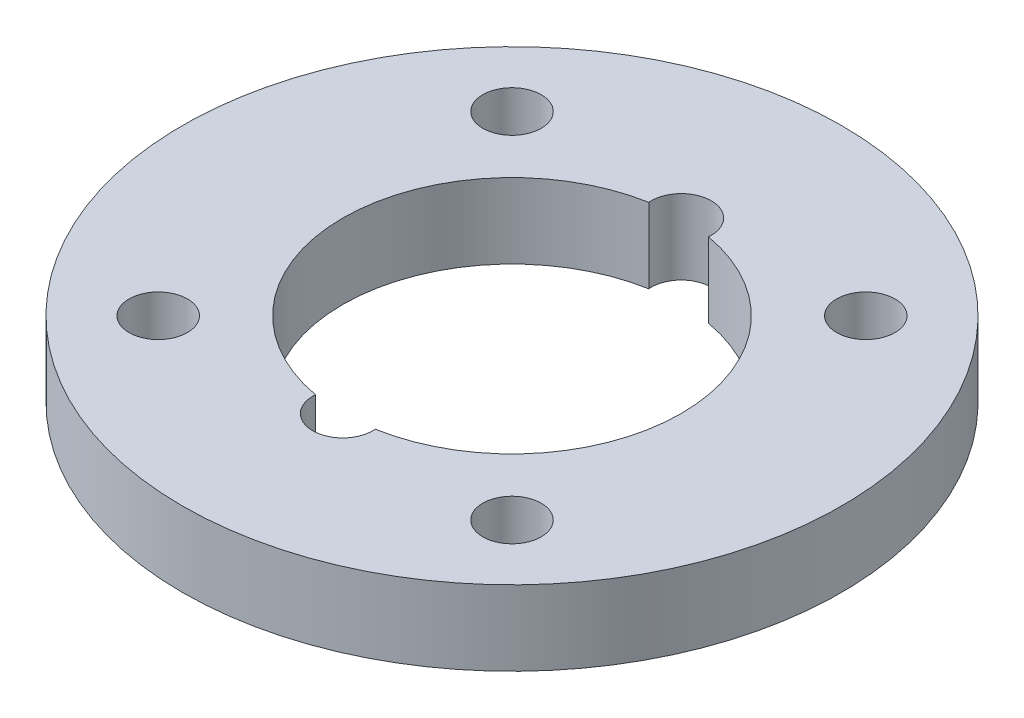
ISO-10303-21;
HEADER;
FILE_DESCRIPTION(('STEP AP214'),'2;1');
FILE_NAME('part.step','',(''),(''),'','','');
FILE_SCHEMA(('AUTOMOTIVE_DESIGN { 1 0 10303 214 1 1 1 1 }'));
ENDSEC;
DATA;
#1=APPLICATION_CONTEXT('core data for automotive mechanical design processes');
#2=APPLICATION_PROTOCOL_DEFINITION('international standard','automotive_design',2000,#1);
#3=PRODUCT_CONTEXT('',#1,'mechanical');
#4=PRODUCT('Part','Part','',(#3));
#5=PRODUCT_RELATED_PRODUCT_CATEGORY('part','',(#4));
#6=PRODUCT_DEFINITION_FORMATION('','',#4);
#7=PRODUCT_DEFINITION_CONTEXT('part definition',#1,'design');
#8=PRODUCT_DEFINITION('design','',#6,#7);
#9=PRODUCT_DEFINITION_SHAPE('','',#8);
#10=(LENGTH_UNIT() NAMED_UNIT(*) SI_UNIT(.MILLI.,.METRE.));
#11=(NAMED_UNIT(*) PLANE_ANGLE_UNIT() SI_UNIT($,.RADIAN.));
#12=(NAMED_UNIT(*) SI_UNIT($,.STERADIAN.) SOLID_ANGLE_UNIT());
#13=UNCERTAINTY_MEASURE_WITH_UNIT(LENGTH_MEASURE(1.E-05),#10,'distance_accuracy_value','');
#14=(GEOMETRIC_REPRESENTATION_CONTEXT(3) GLOBAL_UNCERTAINTY_ASSIGNED_CONTEXT((#13)) GLOBAL_UNIT_ASSIGNED_CONTEXT((#10,
#11,#12)) REPRESENTATION_CONTEXT('',''));
#15=CARTESIAN_POINT('',(0.,0.,0.));
#16=DIRECTION('',(0.,0.,1.));
#17=DIRECTION('',(1.,0.,0.));
#18=AXIS2_PLACEMENT_3D('',#15,#16,#17);
#19=CARTESIAN_POINT('',(0.,6.35,14.351));
#20=DIRECTION('',(0.,-1.,0.));
#21=DIRECTION('',(0.,0.,-1.));
#22=AXIS2_PLACEMENT_3D('',#19,#20,#21);
#23=CYLINDRICAL_SURFACE('',#22,2.53999999999997);
#24=CARTESIAN_POINT('',(0.,0.,14.351));
#25=DIRECTION('',(0.,1.,0.));
#26=DIRECTION('',(0.,0.,1.));
#27=AXIS2_PLACEMENT_3D('',#24,#25,#26);
#28=CIRCLE('',#27,2.53999999999997);
#29=CARTESIAN_POINT('',(2.53003448762568,0.,14.1262212389381));
#30=VERTEX_POINT('',#29);
#31=CARTESIAN_POINT('',(-2.53003448762568,0.,14.1262212389381));
#32=VERTEX_POINT('',#31);
#33=EDGE_CURVE('E125',#30,#32,#28,.F.);
#34=ORIENTED_EDGE('',*,*,#33,.T.);
#35=DIRECTION('',(0.,-1.,0.));
#36=VECTOR('',#35,1.);
#37=CARTESIAN_POINT('',(-2.53003448762568,6.35,14.1262212389381));
#38=LINE('',#37,#36);
#39=CARTESIAN_POINT('',(-2.53003448762568,6.35,14.1262212389381));
#40=VERTEX_POINT('',#39);
#41=EDGE_CURVE('E12',#40,#32,#38,.T.);
#42=ORIENTED_EDGE('',*,*,#41,.F.);
#43=CARTESIAN_POINT('',(0.,6.35,14.351));
#44=DIRECTION('',(0.,1.,0.));
#45=DIRECTION('',(0.,0.,1.));
#46=AXIS2_PLACEMENT_3D('',#43,#44,#45);
#47=CIRCLE('',#46,2.53999999999997);
#48=CARTESIAN_POINT('',(2.53003448762568,6.35,14.1262212389381));
#49=VERTEX_POINT('',#48);
#50=EDGE_CURVE('E100',#49,#40,#47,.F.);
#51=ORIENTED_EDGE('',*,*,#50,.F.);
#52=DIRECTION('',(0.,-1.,0.));
#53=VECTOR('',#52,1.);
#54=CARTESIAN_POINT('',(2.53003448762568,6.35,14.1262212389381));
#55=LINE('',#54,#53);
#56=EDGE_CURVE('E103',#49,#30,#55,.T.);
#57=ORIENTED_EDGE('',*,*,#56,.T.);
#58=EDGE_LOOP('',(#34,#42,#51,#57));
#59=FACE_BOUND('',#58,.T.);
#60=ADVANCED_FACE('F44',(#59),#23,.F.);
#61=CARTESIAN_POINT('',(0.,6.35,0.));
#62=DIRECTION('',(0.,-1.,0.));
#63=DIRECTION('',(0.,0.,-1.));
#64=AXIS2_PLACEMENT_3D('',#61,#62,#63);
#65=CYLINDRICAL_SURFACE('',#64,14.351);
#66=CARTESIAN_POINT('',(0.,0.,0.));
#67=DIRECTION('',(0.,1.,0.));
#68=DIRECTION('',(0.,0.,1.));
#69=AXIS2_PLACEMENT_3D('',#66,#67,#68);
#70=CIRCLE('',#69,14.351);
#71=CARTESIAN_POINT('',(-2.53003448762579,0.,-14.1262212389381));
#72=VERTEX_POINT('',#71);
#73=EDGE_CURVE('E102',#32,#72,#70,.F.);
#74=ORIENTED_EDGE('',*,*,#73,.T.);
#75=DIRECTION('',(0.,-1.,0.));
#76=VECTOR('',#75,1.);
#77=CARTESIAN_POINT('',(-2.53003448762579,6.35,-14.1262212389381));
#78=LINE('',#77,#76);
#79=CARTESIAN_POINT('',(-2.53003448762579,6.35,-14.1262212389381));
#80=VERTEX_POINT('',#79);
#81=EDGE_CURVE('E53',#80,#72,#78,.T.);
#82=ORIENTED_EDGE('',*,*,#81,.F.);
#83=CARTESIAN_POINT('',(0.,6.35,0.));
#84=DIRECTION('',(0.,1.,0.));
#85=DIRECTION('',(0.,0.,1.));
#86=AXIS2_PLACEMENT_3D('',#83,#84,#85);
#87=CIRCLE('',#86,14.351);
#88=EDGE_CURVE('E95',#40,#80,#87,.F.);
#89=ORIENTED_EDGE('',*,*,#88,.F.);
#90=ORIENTED_EDGE('',*,*,#41,.T.);
#91=EDGE_LOOP('',(#74,#82,#89,#90));
#92=FACE_BOUND('',#91,.T.);
#93=ADVANCED_FACE('F99',(#92),#65,.F.);
#94=CARTESIAN_POINT('',(0.,6.35,-14.351));
#95=DIRECTION('',(0.,-1.,0.));
#96=DIRECTION('',(0.,0.,-1.));
#97=AXIS2_PLACEMENT_3D('',#94,#95,#96);
#98=CYLINDRICAL_SURFACE('',#97,2.54000000000008);
#99=CARTESIAN_POINT('',(0.,0.,-14.351));
#100=DIRECTION('',(0.,1.,0.));
#101=DIRECTION('',(0.,0.,1.));
#102=AXIS2_PLACEMENT_3D('',#99,#100,#101);
#103=CIRCLE('',#102,2.54000000000008);
#104=CARTESIAN_POINT('',(2.53003448762579,0.,-14.1262212389381));
#105=VERTEX_POINT('',#104);
#106=EDGE_CURVE('E80',#72,#105,#103,.F.);
#107=ORIENTED_EDGE('',*,*,#106,.T.);
#108=DIRECTION('',(0.,-1.,0.));
#109=VECTOR('',#108,1.);
#110=CARTESIAN_POINT('',(2.53003448762579,6.35,-14.1262212389381));
#111=LINE('',#110,#109);
#112=CARTESIAN_POINT('',(2.53003448762579,6.35,-14.1262212389381));
#113=VERTEX_POINT('',#112);
#114=EDGE_CURVE('E105',#113,#105,#111,.T.);
#115=ORIENTED_EDGE('',*,*,#114,.F.);
#116=CARTESIAN_POINT('',(0.,6.35,-14.351));
#117=DIRECTION('',(0.,1.,0.));
#118=DIRECTION('',(0.,0.,1.));
#119=AXIS2_PLACEMENT_3D('',#116,#117,#118);
#120=CIRCLE('',#119,2.54000000000008);
#121=EDGE_CURVE('E94',#80,#113,#120,.F.);
#122=ORIENTED_EDGE('',*,*,#121,.F.);
#123=ORIENTED_EDGE('',*,*,#81,.T.);
#124=EDGE_LOOP('',(#107,#115,#122,#123));
#125=FACE_BOUND('',#124,.T.);
#126=ADVANCED_FACE('F104',(#125),#98,.F.);
#127=CARTESIAN_POINT('',(0.,6.35,0.));
#128=DIRECTION('',(0.,-1.,0.));
#129=DIRECTION('',(0.,0.,-1.));
#130=AXIS2_PLACEMENT_3D('',#127,#128,#129);
#131=CYLINDRICAL_SURFACE('',#130,27.94);
#132=CARTESIAN_POINT('',(0.,6.35,0.));
#133=DIRECTION('',(0.,1.,0.));
#134=DIRECTION('',(0.,0.,1.));
#135=AXIS2_PLACEMENT_3D('',#132,#133,#134);
#136=CIRCLE('',#135,27.94);
#137=CARTESIAN_POINT('',(0.,6.35,27.94));
#138=VERTEX_POINT('',#137);
#139=EDGE_CURVE('E140',#138,#138,#136,.T.);
#140=ORIENTED_EDGE('',*,*,#139,.F.);
#141=EDGE_LOOP('',(#140));
#142=FACE_BOUND('',#141,.T.);
#143=CARTESIAN_POINT('',(0.,0.,0.));
#144=DIRECTION('',(0.,1.,0.));
#145=DIRECTION('',(0.,0.,1.));
#146=AXIS2_PLACEMENT_3D('',#143,#144,#145);
#147=CIRCLE('',#146,27.94);
#148=CARTESIAN_POINT('',(0.,0.,27.94));
#149=VERTEX_POINT('',#148);
#150=EDGE_CURVE('E123',#149,#149,#147,.T.);
#151=ORIENTED_EDGE('',*,*,#150,.T.);
#152=EDGE_LOOP('',(#151));
#153=FACE_BOUND('',#152,.T.);
#154=ADVANCED_FACE('F168',(#142,#153),#131,.T.);
#155=CARTESIAN_POINT('',(14.9970277221856,6.35,14.9970277221853));
#156=DIRECTION('',(0.,-1.,0.));
#157=DIRECTION('',(0.,0.,-1.));
#158=AXIS2_PLACEMENT_3D('',#155,#156,#157);
#159=CYLINDRICAL_SURFACE('',#158,2.475);
#160=CARTESIAN_POINT('',(14.9970277221856,6.35,14.9970277221853));
#161=DIRECTION('',(0.,1.,0.));
#162=DIRECTION('',(0.,0.,1.));
#163=AXIS2_PLACEMENT_3D('',#160,#161,#162);
#164=CIRCLE('',#163,2.475);
#165=CARTESIAN_POINT('',(14.9970277221856,6.35,17.4720277221853));
#166=VERTEX_POINT('',#165);
#167=EDGE_CURVE('E137',#166,#166,#164,.T.);
#168=ORIENTED_EDGE('',*,*,#167,.T.);
#169=EDGE_LOOP('',(#168));
#170=FACE_BOUND('',#169,.T.);
#171=CARTESIAN_POINT('',(14.9970277221856,0.,14.9970277221853));
#172=DIRECTION('',(0.,1.,0.));
#173=DIRECTION('',(0.,0.,1.));
#174=AXIS2_PLACEMENT_3D('',#171,#172,#173);
#175=CIRCLE('',#174,2.475);
#176=CARTESIAN_POINT('',(14.9970277221856,0.,17.4720277221853));
#177=VERTEX_POINT('',#176);
#178=EDGE_CURVE('E116',#177,#177,#175,.T.);
#179=ORIENTED_EDGE('',*,*,#178,.F.);
#180=EDGE_LOOP('',(#179));
#181=FACE_BOUND('',#180,.T.);
#182=ADVANCED_FACE('F170',(#170,#181),#159,.F.);
#183=CARTESIAN_POINT('',(14.9970277221854,6.35,-14.9970277221856));
#184=DIRECTION('',(0.,-1.,0.));
#185=DIRECTION('',(0.,0.,-1.));
#186=AXIS2_PLACEMENT_3D('',#183,#184,#185);
#187=CYLINDRICAL_SURFACE('',#186,2.47500000000001);
#188=CARTESIAN_POINT('',(14.9970277221854,6.35,-14.9970277221856));
#189=DIRECTION('',(0.,1.,0.));
#190=DIRECTION('',(0.,0.,1.));
#191=AXIS2_PLACEMENT_3D('',#188,#189,#190);
#192=CIRCLE('',#191,2.47500000000001);
#193=CARTESIAN_POINT('',(14.9970277221854,6.35,-12.5220277221856));
#194=VERTEX_POINT('',#193);
#195=EDGE_CURVE('E143',#194,#194,#192,.T.);
#196=ORIENTED_EDGE('',*,*,#195,.T.);
#197=EDGE_LOOP('',(#196));
#198=FACE_BOUND('',#197,.T.);
#199=CARTESIAN_POINT('',(14.9970277221854,0.,-14.9970277221856));
#200=DIRECTION('',(0.,1.,0.));
#201=DIRECTION('',(0.,0.,1.));
#202=AXIS2_PLACEMENT_3D('',#199,#200,#201);
#203=CIRCLE('',#202,2.47500000000001);
#204=CARTESIAN_POINT('',(14.9970277221854,0.,-12.5220277221856));
#205=VERTEX_POINT('',#204);
#206=EDGE_CURVE('E113',#205,#205,#203,.T.);
#207=ORIENTED_EDGE('',*,*,#206,.F.);
#208=EDGE_LOOP('',(#207));
#209=FACE_BOUND('',#208,.T.);
#210=ADVANCED_FACE('F189',(#198,#209),#187,.F.);
#211=CARTESIAN_POINT('',(-14.9970277221856,6.35,-14.9970277221853));
#212=DIRECTION('',(0.,-1.,0.));
#213=DIRECTION('',(0.,0.,-1.));
#214=AXIS2_PLACEMENT_3D('',#211,#212,#213);
#215=CYLINDRICAL_SURFACE('',#214,2.47500000000001);
#216=CARTESIAN_POINT('',(-14.9970277221856,6.35,-14.9970277221853));
#217=DIRECTION('',(0.,1.,0.));
#218=DIRECTION('',(0.,0.,1.));
#219=AXIS2_PLACEMENT_3D('',#216,#217,#218);
#220=CIRCLE('',#219,2.47500000000001);
#221=CARTESIAN_POINT('',(-14.9970277221856,6.35,-12.5220277221853));
#222=VERTEX_POINT('',#221);
#223=EDGE_CURVE('E150',#222,#222,#220,.T.);
#224=ORIENTED_EDGE('',*,*,#223,.T.);
#225=EDGE_LOOP('',(#224));
#226=FACE_BOUND('',#225,.T.);
#227=CARTESIAN_POINT('',(-14.9970277221856,0.,-14.9970277221853));
#228=DIRECTION('',(0.,1.,0.));
#229=DIRECTION('',(0.,0.,1.));
#230=AXIS2_PLACEMENT_3D('',#227,#228,#229);
#231=CIRCLE('',#230,2.47500000000001);
#232=CARTESIAN_POINT('',(-14.9970277221856,0.,-12.5220277221853));
#233=VERTEX_POINT('',#232);
#234=EDGE_CURVE('E115',#233,#233,#231,.T.);
#235=ORIENTED_EDGE('',*,*,#234,.F.);
#236=EDGE_LOOP('',(#235));
#237=FACE_BOUND('',#236,.T.);
#238=ADVANCED_FACE('F194',(#226,#237),#215,.F.);
#239=CARTESIAN_POINT('',(-14.9970277221854,6.35,14.9970277221856));
#240=DIRECTION('',(0.,-1.,0.));
#241=DIRECTION('',(0.,0.,-1.));
#242=AXIS2_PLACEMENT_3D('',#239,#240,#241);
#243=CYLINDRICAL_SURFACE('',#242,2.475);
#244=CARTESIAN_POINT('',(-14.9970277221854,6.35,14.9970277221856));
#245=DIRECTION('',(0.,1.,0.));
#246=DIRECTION('',(0.,0.,1.));
#247=AXIS2_PLACEMENT_3D('',#244,#245,#246);
#248=CIRCLE('',#247,2.475);
#249=CARTESIAN_POINT('',(-14.9970277221854,6.35,17.4720277221856));
#250=VERTEX_POINT('',#249);
#251=EDGE_CURVE('E127',#250,#250,#248,.T.);
#252=ORIENTED_EDGE('',*,*,#251,.T.);
#253=EDGE_LOOP('',(#252));
#254=FACE_BOUND('',#253,.T.);
#255=CARTESIAN_POINT('',(-14.9970277221854,0.,14.9970277221856));
#256=DIRECTION('',(0.,1.,0.));
#257=DIRECTION('',(0.,0.,1.));
#258=AXIS2_PLACEMENT_3D('',#255,#256,#257);
#259=CIRCLE('',#258,2.475);
#260=CARTESIAN_POINT('',(-14.9970277221854,0.,17.4720277221856));
#261=VERTEX_POINT('',#260);
#262=EDGE_CURVE('E109',#261,#261,#259,.T.);
#263=ORIENTED_EDGE('',*,*,#262,.F.);
#264=EDGE_LOOP('',(#263));
#265=FACE_BOUND('',#264,.T.);
#266=ADVANCED_FACE('F50',(#254,#265),#243,.F.);
#267=CARTESIAN_POINT('',(0.,6.35,0.));
#268=DIRECTION('',(0.,-1.,0.));
#269=DIRECTION('',(0.,0.,-1.));
#270=AXIS2_PLACEMENT_3D('',#267,#268,#269);
#271=CYLINDRICAL_SURFACE('',#270,14.351);
#272=CARTESIAN_POINT('',(0.,0.,0.));
#273=DIRECTION('',(0.,1.,0.));
#274=DIRECTION('',(0.,0.,1.));
#275=AXIS2_PLACEMENT_3D('',#272,#273,#274);
#276=CIRCLE('',#275,14.351);
#277=EDGE_CURVE('E82',#105,#30,#276,.F.);
#278=ORIENTED_EDGE('',*,*,#277,.T.);
#279=ORIENTED_EDGE('',*,*,#56,.F.);
#280=CARTESIAN_POINT('',(0.,6.35,0.));
#281=DIRECTION('',(0.,1.,0.));
#282=DIRECTION('',(0.,0.,1.));
#283=AXIS2_PLACEMENT_3D('',#280,#281,#282);
#284=CIRCLE('',#283,14.351);
#285=EDGE_CURVE('E65',#113,#49,#284,.F.);
#286=ORIENTED_EDGE('',*,*,#285,.F.);
#287=ORIENTED_EDGE('',*,*,#114,.T.);
#288=EDGE_LOOP('',(#278,#279,#286,#287));
#289=FACE_BOUND('',#288,.T.);
#290=ADVANCED_FACE('F135',(#289),#271,.F.);
#291=CARTESIAN_POINT('',(0.,6.35,0.));
#292=DIRECTION('',(0.,1.,0.));
#293=DIRECTION('',(0.,0.,1.));
#294=AXIS2_PLACEMENT_3D('',#291,#292,#293);
#295=PLANE('',#294);
#296=ORIENTED_EDGE('',*,*,#251,.F.);
#297=EDGE_LOOP('',(#296));
#298=FACE_BOUND('',#297,.T.);
#299=ORIENTED_EDGE('',*,*,#223,.F.);
#300=EDGE_LOOP('',(#299));
#301=FACE_BOUND('',#300,.T.);
#302=ORIENTED_EDGE('',*,*,#195,.F.);
#303=EDGE_LOOP('',(#302));
#304=FACE_BOUND('',#303,.T.);
#305=ORIENTED_EDGE('',*,*,#167,.F.);
#306=EDGE_LOOP('',(#305));
#307=FACE_BOUND('',#306,.T.);
#308=ORIENTED_EDGE('',*,*,#139,.T.);
#309=EDGE_LOOP('',(#308));
#310=FACE_BOUND('',#309,.T.);
#311=ORIENTED_EDGE('',*,*,#50,.T.);
#312=ORIENTED_EDGE('',*,*,#88,.T.);
#313=ORIENTED_EDGE('',*,*,#121,.T.);
#314=ORIENTED_EDGE('',*,*,#285,.T.);
#315=EDGE_LOOP('',(#311,#312,#313,#314));
#316=FACE_BOUND('',#315,.T.);
#317=ADVANCED_FACE('F93',(#298,#301,#304,#307,#310,#316),#295,.T.);
#318=CARTESIAN_POINT('',(0.,0.,0.));
#319=DIRECTION('',(0.,1.,0.));
#320=DIRECTION('',(0.,0.,1.));
#321=AXIS2_PLACEMENT_3D('',#318,#319,#320);
#322=PLANE('',#321);
#323=ORIENTED_EDGE('',*,*,#262,.T.);
#324=EDGE_LOOP('',(#323));
#325=FACE_BOUND('',#324,.T.);
#326=ORIENTED_EDGE('',*,*,#234,.T.);
#327=EDGE_LOOP('',(#326));
#328=FACE_BOUND('',#327,.T.);
#329=ORIENTED_EDGE('',*,*,#206,.T.);
#330=EDGE_LOOP('',(#329));
#331=FACE_BOUND('',#330,.T.);
#332=ORIENTED_EDGE('',*,*,#178,.T.);
#333=EDGE_LOOP('',(#332));
#334=FACE_BOUND('',#333,.T.);
#335=ORIENTED_EDGE('',*,*,#150,.F.);
#336=EDGE_LOOP('',(#335));
#337=FACE_BOUND('',#336,.T.);
#338=ORIENTED_EDGE('',*,*,#33,.F.);
#339=ORIENTED_EDGE('',*,*,#277,.F.);
#340=ORIENTED_EDGE('',*,*,#106,.F.);
#341=ORIENTED_EDGE('',*,*,#73,.F.);
#342=EDGE_LOOP('',(#338,#339,#340,#341));
#343=FACE_BOUND('',#342,.T.);
#344=ADVANCED_FACE('F134',(#325,#328,#331,#334,#337,#343),#322,.F.);
#345=CLOSED_SHELL('',(#60,#93,#126,#154,#182,#210,#238,#266,#290,#317,#344));
#346=MANIFOLD_SOLID_BREP('B2',#345);
#347=ADVANCED_BREP_SHAPE_REPRESENTATION('',(#18,#346),#14);
#348=SHAPE_DEFINITION_REPRESENTATION(#9,#347);
ENDSEC;
END-ISO-10303-21;
